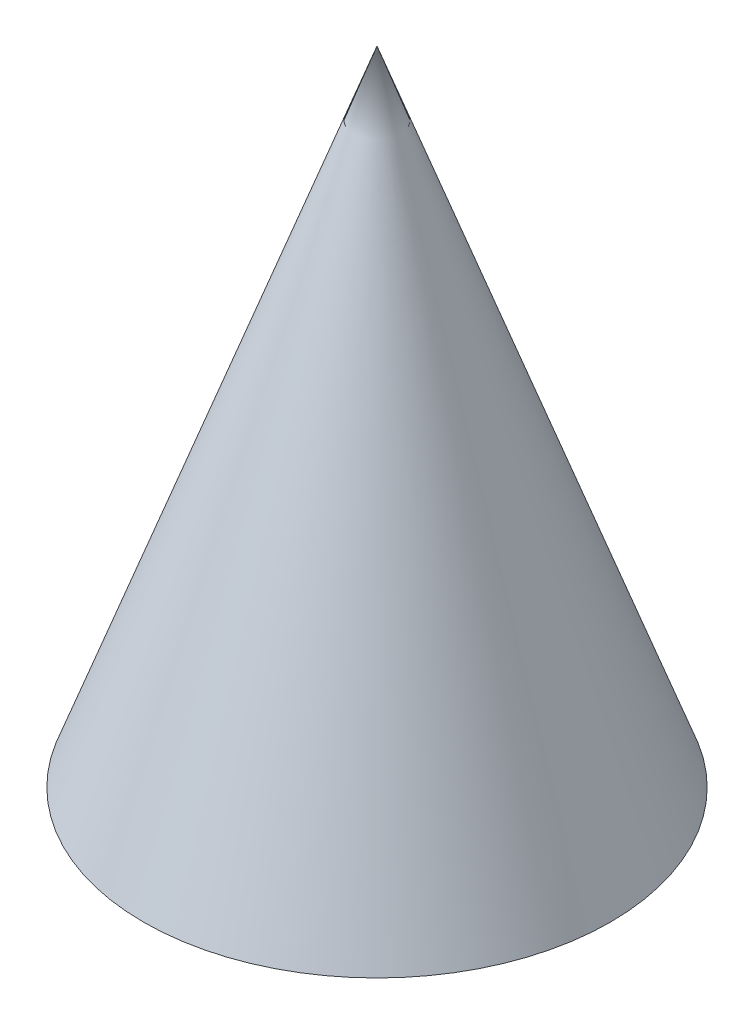
ISO-10303-21;
HEADER;
FILE_DESCRIPTION(('STEP AP214'),'2;1');
FILE_NAME('part.step','',(''),(''),'','','');
FILE_SCHEMA(('AUTOMOTIVE_DESIGN { 1 0 10303 214 1 1 1 1 }'));
ENDSEC;
DATA;
#1=APPLICATION_CONTEXT('core data for automotive mechanical design processes');
#2=APPLICATION_PROTOCOL_DEFINITION('international standard','automotive_design',2000,#1);
#3=PRODUCT_CONTEXT('',#1,'mechanical');
#4=PRODUCT('Part','Part','',(#3));
#5=PRODUCT_RELATED_PRODUCT_CATEGORY('part','',(#4));
#6=PRODUCT_DEFINITION_FORMATION('','',#4);
#7=PRODUCT_DEFINITION_CONTEXT('part definition',#1,'design');
#8=PRODUCT_DEFINITION('design','',#6,#7);
#9=PRODUCT_DEFINITION_SHAPE('','',#8);
#10=(LENGTH_UNIT() NAMED_UNIT(*) SI_UNIT(.MILLI.,.METRE.));
#11=(NAMED_UNIT(*) PLANE_ANGLE_UNIT() SI_UNIT($,.RADIAN.));
#12=(NAMED_UNIT(*) SI_UNIT($,.STERADIAN.) SOLID_ANGLE_UNIT());
#13=UNCERTAINTY_MEASURE_WITH_UNIT(LENGTH_MEASURE(1.E-05),#10,'distance_accuracy_value','');
#14=(GEOMETRIC_REPRESENTATION_CONTEXT(3) GLOBAL_UNCERTAINTY_ASSIGNED_CONTEXT((#13)) GLOBAL_UNIT_ASSIGNED_CONTEXT((#10,
#11,#12)) REPRESENTATION_CONTEXT('',''));
#15=CARTESIAN_POINT('',(0.,0.,0.));
#16=DIRECTION('',(0.,0.,1.));
#17=DIRECTION('',(1.,0.,0.));
#18=AXIS2_PLACEMENT_3D('',#15,#16,#17);
#19=CARTESIAN_POINT('',(20.,0.,0.));
#20=DIRECTION('',(0.,-1.,0.));
#21=DIRECTION('',(0.,0.,-1.));
#22=AXIS2_PLACEMENT_3D('',#19,#20,#21);
#23=PLANE('',#22);
#24=CARTESIAN_POINT('',(0.,0.,0.));
#25=DIRECTION('',(0.,-1.,0.));
#26=DIRECTION('',(0.,0.,-1.));
#27=AXIS2_PLACEMENT_3D('',#24,#25,#26);
#28=CIRCLE('',#27,20.);
#29=CARTESIAN_POINT('',(0.,0.,-20.));
#30=VERTEX_POINT('',#29);
#31=EDGE_CURVE('E11',#30,#30,#28,.T.);
#32=ORIENTED_EDGE('',*,*,#31,.T.);
#33=EDGE_LOOP('',(#32));
#34=FACE_BOUND('',#33,.T.);
#35=ADVANCED_FACE('F32',(#34),#23,.T.);
#36=CARTESIAN_POINT('',(0.,0.,0.));
#37=DIRECTION('',(0.,-1.,0.));
#38=DIRECTION('',(0.,0.,-1.));
#39=AXIS2_PLACEMENT_3D('',#36,#37,#38);
#40=CONICAL_SURFACE('',#39,20.,0.348771003583907);
#41=CARTESIAN_POINT('',(0.,55.,0.));
#42=VERTEX_POINT('',#41);
#43=VERTEX_LOOP('',#42);
#44=FACE_BOUND('',#43,.T.);
#45=ORIENTED_EDGE('',*,*,#31,.F.);
#46=EDGE_LOOP('',(#45));
#47=FACE_BOUND('',#46,.T.);
#48=ADVANCED_FACE('F39',(#44,#47),#40,.T.);
#49=CLOSED_SHELL('',(#35,#48));
#50=MANIFOLD_SOLID_BREP('B2',#49);
#51=ADVANCED_BREP_SHAPE_REPRESENTATION('',(#18,#50),#14);
#52=SHAPE_DEFINITION_REPRESENTATION(#9,#51);
ENDSEC;
END-ISO-10303-21;
